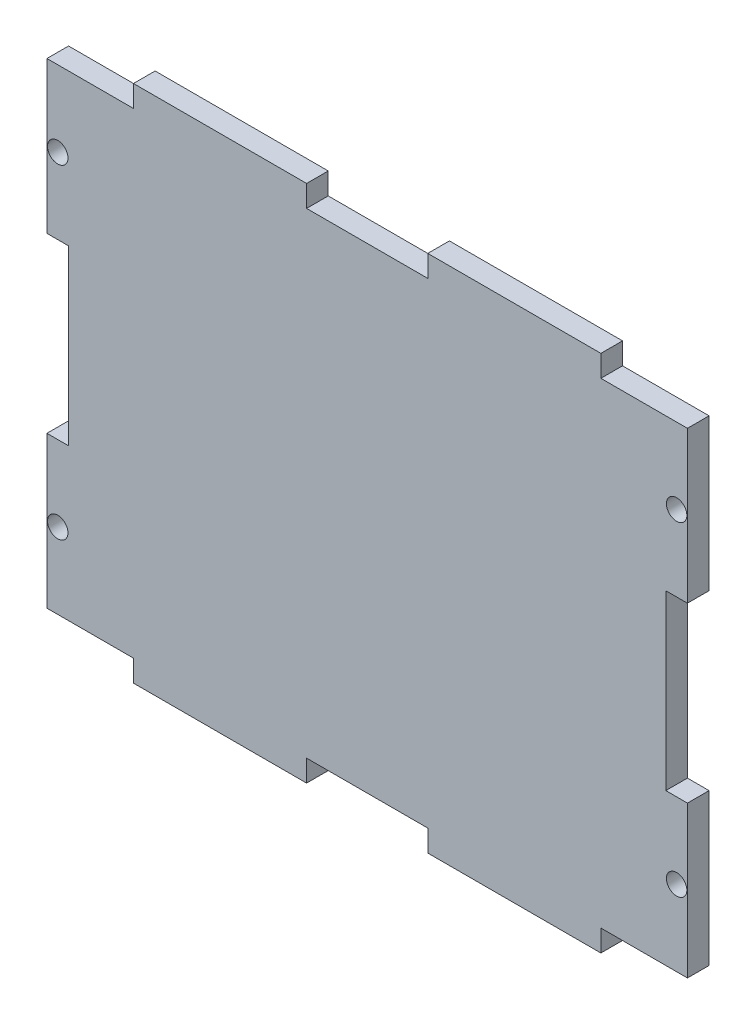
ISO-10303-21;
HEADER;
FILE_DESCRIPTION(('STEP AP214'),'2;1');
FILE_NAME('part.step','',(''),(''),'','','');
FILE_SCHEMA(('AUTOMOTIVE_DESIGN { 1 0 10303 214 1 1 1 1 }'));
ENDSEC;
DATA;
#1=APPLICATION_CONTEXT('core data for automotive mechanical design processes');
#2=APPLICATION_PROTOCOL_DEFINITION('international standard','automotive_design',2000,#1);
#3=PRODUCT_CONTEXT('',#1,'mechanical');
#4=PRODUCT('Part','Part','',(#3));
#5=PRODUCT_RELATED_PRODUCT_CATEGORY('part','',(#4));
#6=PRODUCT_DEFINITION_FORMATION('','',#4);
#7=PRODUCT_DEFINITION_CONTEXT('part definition',#1,'design');
#8=PRODUCT_DEFINITION('design','',#6,#7);
#9=PRODUCT_DEFINITION_SHAPE('','',#8);
#10=(LENGTH_UNIT() NAMED_UNIT(*) SI_UNIT(.MILLI.,.METRE.));
#11=(NAMED_UNIT(*) PLANE_ANGLE_UNIT() SI_UNIT($,.RADIAN.));
#12=(NAMED_UNIT(*) SI_UNIT($,.STERADIAN.) SOLID_ANGLE_UNIT());
#13=UNCERTAINTY_MEASURE_WITH_UNIT(LENGTH_MEASURE(1.E-05),#10,'distance_accuracy_value','');
#14=(GEOMETRIC_REPRESENTATION_CONTEXT(3) GLOBAL_UNCERTAINTY_ASSIGNED_CONTEXT((#13)) GLOBAL_UNIT_ASSIGNED_CONTEXT((#10,
#11,#12)) REPRESENTATION_CONTEXT('',''));
#15=CARTESIAN_POINT('',(0.,0.,0.));
#16=DIRECTION('',(0.,0.,1.));
#17=DIRECTION('',(1.,0.,0.));
#18=AXIS2_PLACEMENT_3D('',#15,#16,#17);
#19=CARTESIAN_POINT('',(-46.99,-38.1,3.175));
#20=DIRECTION('',(1.,0.,0.));
#21=DIRECTION('',(0.,0.,-1.));
#22=AXIS2_PLACEMENT_3D('',#19,#20,#21);
#23=PLANE('',#22);
#24=DIRECTION('',(0.,-1.,0.));
#25=VECTOR('',#24,1.);
#26=CARTESIAN_POINT('',(-46.99,-38.1,3.175));
#27=LINE('',#26,#25);
#28=CARTESIAN_POINT('',(-46.99,-12.7,3.175));
#29=VERTEX_POINT('',#28);
#30=CARTESIAN_POINT('',(-46.99,-34.925,3.175));
#31=VERTEX_POINT('',#30);
#32=EDGE_CURVE('E244',#29,#31,#27,.T.);
#33=ORIENTED_EDGE('',*,*,#32,.F.);
#34=DIRECTION('',(0.,0.,-1.));
#35=VECTOR('',#34,1.);
#36=CARTESIAN_POINT('',(-46.99,-12.7,3.175));
#37=LINE('',#36,#35);
#38=CARTESIAN_POINT('',(-46.99,-12.7,0.));
#39=VERTEX_POINT('',#38);
#40=EDGE_CURVE('E268',#29,#39,#37,.T.);
#41=ORIENTED_EDGE('',*,*,#40,.T.);
#42=DIRECTION('',(0.,-1.,0.));
#43=VECTOR('',#42,1.);
#44=CARTESIAN_POINT('',(-46.99,-38.1,0.));
#45=LINE('',#44,#43);
#46=CARTESIAN_POINT('',(-46.99,-34.925,0.));
#47=VERTEX_POINT('',#46);
#48=EDGE_CURVE('E258',#39,#47,#45,.T.);
#49=ORIENTED_EDGE('',*,*,#48,.T.);
#50=DIRECTION('',(0.,0.,1.));
#51=VECTOR('',#50,1.);
#52=CARTESIAN_POINT('',(-46.99,-34.925,0.));
#53=LINE('',#52,#51);
#54=EDGE_CURVE('E267',#47,#31,#53,.T.);
#55=ORIENTED_EDGE('',*,*,#54,.T.);
#56=EDGE_LOOP('',(#33,#41,#49,#55));
#57=FACE_BOUND('',#56,.T.);
#58=ADVANCED_FACE('F33',(#57),#23,.F.);
#59=CARTESIAN_POINT('',(46.99,-38.1,3.175));
#60=DIRECTION('',(-1.,0.,0.));
#61=DIRECTION('',(0.,0.,1.));
#62=AXIS2_PLACEMENT_3D('',#59,#60,#61);
#63=PLANE('',#62);
#64=DIRECTION('',(0.,1.,0.));
#65=VECTOR('',#64,1.);
#66=CARTESIAN_POINT('',(46.99,-38.1,0.));
#67=LINE('',#66,#65);
#68=CARTESIAN_POINT('',(46.99,-34.925,0.));
#69=VERTEX_POINT('',#68);
#70=CARTESIAN_POINT('',(46.99,-12.7,0.));
#71=VERTEX_POINT('',#70);
#72=EDGE_CURVE('E251',#69,#71,#67,.T.);
#73=ORIENTED_EDGE('',*,*,#72,.T.);
#74=DIRECTION('',(0.,0.,-1.));
#75=VECTOR('',#74,1.);
#76=CARTESIAN_POINT('',(46.99,-12.7,3.175));
#77=LINE('',#76,#75);
#78=CARTESIAN_POINT('',(46.99,-12.7,3.175));
#79=VERTEX_POINT('',#78);
#80=EDGE_CURVE('E489',#79,#71,#77,.T.);
#81=ORIENTED_EDGE('',*,*,#80,.F.);
#82=DIRECTION('',(0.,1.,0.));
#83=VECTOR('',#82,1.);
#84=CARTESIAN_POINT('',(46.99,-38.1,3.175));
#85=LINE('',#84,#83);
#86=CARTESIAN_POINT('',(46.99,-34.925,3.175));
#87=VERTEX_POINT('',#86);
#88=EDGE_CURVE('E296',#87,#79,#85,.T.);
#89=ORIENTED_EDGE('',*,*,#88,.F.);
#90=DIRECTION('',(0.,0.,1.));
#91=VECTOR('',#90,1.);
#92=CARTESIAN_POINT('',(46.99,-34.925,0.));
#93=LINE('',#92,#91);
#94=EDGE_CURVE('E335',#69,#87,#93,.T.);
#95=ORIENTED_EDGE('',*,*,#94,.F.);
#96=EDGE_LOOP('',(#73,#81,#89,#95));
#97=FACE_BOUND('',#96,.T.);
#98=ADVANCED_FACE('F363',(#97),#63,.F.);
#99=CARTESIAN_POINT('',(-46.99,38.1,3.175));
#100=DIRECTION('',(0.,-1.,0.));
#101=DIRECTION('',(0.,0.,-1.));
#102=AXIS2_PLACEMENT_3D('',#99,#100,#101);
#103=PLANE('',#102);
#104=DIRECTION('',(-1.,0.,0.));
#105=VECTOR('',#104,1.);
#106=CARTESIAN_POINT('',(-46.99,38.1,0.));
#107=LINE('',#106,#105);
#108=CARTESIAN_POINT('',(-8.88999999999997,38.1,0.));
#109=VERTEX_POINT('',#108);
#110=CARTESIAN_POINT('',(-34.29,38.1,0.));
#111=VERTEX_POINT('',#110);
#112=EDGE_CURVE('E254',#109,#111,#107,.T.);
#113=ORIENTED_EDGE('',*,*,#112,.T.);
#114=DIRECTION('',(0.,0.,1.));
#115=VECTOR('',#114,1.);
#116=CARTESIAN_POINT('',(-34.29,38.1,0.));
#117=LINE('',#116,#115);
#118=CARTESIAN_POINT('',(-34.29,38.1,3.175));
#119=VERTEX_POINT('',#118);
#120=EDGE_CURVE('E397',#111,#119,#117,.T.);
#121=ORIENTED_EDGE('',*,*,#120,.T.);
#122=DIRECTION('',(-1.,0.,0.));
#123=VECTOR('',#122,1.);
#124=CARTESIAN_POINT('',(-46.99,38.1,3.175));
#125=LINE('',#124,#123);
#126=CARTESIAN_POINT('',(-8.88999999999997,38.1,3.175));
#127=VERTEX_POINT('',#126);
#128=EDGE_CURVE('E298',#127,#119,#125,.T.);
#129=ORIENTED_EDGE('',*,*,#128,.F.);
#130=DIRECTION('',(0.,0.,1.));
#131=VECTOR('',#130,1.);
#132=CARTESIAN_POINT('',(-8.88999999999997,38.1,0.));
#133=LINE('',#132,#131);
#134=EDGE_CURVE('E398',#109,#127,#133,.T.);
#135=ORIENTED_EDGE('',*,*,#134,.F.);
#136=EDGE_LOOP('',(#113,#121,#129,#135));
#137=FACE_BOUND('',#136,.T.);
#138=ADVANCED_FACE('F369',(#137),#103,.F.);
#139=CARTESIAN_POINT('',(-46.99,-38.1,3.175));
#140=DIRECTION('',(0.,1.,0.));
#141=DIRECTION('',(0.,0.,1.));
#142=AXIS2_PLACEMENT_3D('',#139,#140,#141);
#143=PLANE('',#142);
#144=DIRECTION('',(1.,0.,0.));
#145=VECTOR('',#144,1.);
#146=CARTESIAN_POINT('',(-46.99,-38.1,0.));
#147=LINE('',#146,#145);
#148=CARTESIAN_POINT('',(8.89,-38.1,0.));
#149=VERTEX_POINT('',#148);
#150=CARTESIAN_POINT('',(34.29,-38.1,0.));
#151=VERTEX_POINT('',#150);
#152=EDGE_CURVE('E259',#149,#151,#147,.T.);
#153=ORIENTED_EDGE('',*,*,#152,.T.);
#154=DIRECTION('',(0.,0.,1.));
#155=VECTOR('',#154,1.);
#156=CARTESIAN_POINT('',(34.29,-38.1,0.));
#157=LINE('',#156,#155);
#158=CARTESIAN_POINT('',(34.29,-38.1,3.175));
#159=VERTEX_POINT('',#158);
#160=EDGE_CURVE('E474',#151,#159,#157,.T.);
#161=ORIENTED_EDGE('',*,*,#160,.T.);
#162=DIRECTION('',(1.,0.,0.));
#163=VECTOR('',#162,1.);
#164=CARTESIAN_POINT('',(-46.99,-38.1,3.175));
#165=LINE('',#164,#163);
#166=CARTESIAN_POINT('',(8.89,-38.1,3.175));
#167=VERTEX_POINT('',#166);
#168=EDGE_CURVE('E42',#167,#159,#165,.T.);
#169=ORIENTED_EDGE('',*,*,#168,.F.);
#170=DIRECTION('',(0.,0.,1.));
#171=VECTOR('',#170,1.);
#172=CARTESIAN_POINT('',(8.89,-38.1,0.));
#173=LINE('',#172,#171);
#174=EDGE_CURVE('E340',#149,#167,#173,.T.);
#175=ORIENTED_EDGE('',*,*,#174,.F.);
#176=EDGE_LOOP('',(#153,#161,#169,#175));
#177=FACE_BOUND('',#176,.T.);
#178=ADVANCED_FACE('F379',(#177),#143,.F.);
#179=CARTESIAN_POINT('',(46.99,12.7,3.175));
#180=VERTEX_POINT('',#179);
#181=CARTESIAN_POINT('',(46.99,34.925,3.175));
#182=VERTEX_POINT('',#181);
#183=EDGE_CURVE('E299',#180,#182,#85,.T.);
#184=ORIENTED_EDGE('',*,*,#183,.F.);
#185=DIRECTION('',(0.,0.,-1.));
#186=VECTOR('',#185,1.);
#187=CARTESIAN_POINT('',(46.99,12.7,3.175));
#188=LINE('',#187,#186);
#189=CARTESIAN_POINT('',(46.99,12.7,0.));
#190=VERTEX_POINT('',#189);
#191=EDGE_CURVE('E492',#180,#190,#188,.T.);
#192=ORIENTED_EDGE('',*,*,#191,.T.);
#193=CARTESIAN_POINT('',(46.99,34.925,0.));
#194=VERTEX_POINT('',#193);
#195=EDGE_CURVE('E255',#190,#194,#67,.T.);
#196=ORIENTED_EDGE('',*,*,#195,.T.);
#197=DIRECTION('',(0.,0.,1.));
#198=VECTOR('',#197,1.);
#199=CARTESIAN_POINT('',(46.99,34.925,0.));
#200=LINE('',#199,#198);
#201=EDGE_CURVE('E455',#194,#182,#200,.T.);
#202=ORIENTED_EDGE('',*,*,#201,.T.);
#203=EDGE_LOOP('',(#184,#192,#196,#202));
#204=FACE_BOUND('',#203,.T.);
#205=ADVANCED_FACE('F35',(#204),#63,.F.);
#206=CARTESIAN_POINT('',(34.29,38.1,0.));
#207=VERTEX_POINT('',#206);
#208=CARTESIAN_POINT('',(8.89000000000002,38.1,0.));
#209=VERTEX_POINT('',#208);
#210=EDGE_CURVE('E256',#207,#209,#107,.T.);
#211=ORIENTED_EDGE('',*,*,#210,.T.);
#212=DIRECTION('',(0.,0.,1.));
#213=VECTOR('',#212,1.);
#214=CARTESIAN_POINT('',(8.89000000000002,38.1,0.));
#215=LINE('',#214,#213);
#216=CARTESIAN_POINT('',(8.89000000000002,38.1,3.175));
#217=VERTEX_POINT('',#216);
#218=EDGE_CURVE('E440',#209,#217,#215,.T.);
#219=ORIENTED_EDGE('',*,*,#218,.T.);
#220=CARTESIAN_POINT('',(34.29,38.1,3.175));
#221=VERTEX_POINT('',#220);
#222=EDGE_CURVE('E247',#221,#217,#125,.T.);
#223=ORIENTED_EDGE('',*,*,#222,.F.);
#224=DIRECTION('',(0.,0.,1.));
#225=VECTOR('',#224,1.);
#226=CARTESIAN_POINT('',(34.29,38.1,0.));
#227=LINE('',#226,#225);
#228=EDGE_CURVE('E451',#207,#221,#227,.T.);
#229=ORIENTED_EDGE('',*,*,#228,.F.);
#230=EDGE_LOOP('',(#211,#219,#223,#229));
#231=FACE_BOUND('',#230,.T.);
#232=ADVANCED_FACE('F373',(#231),#103,.F.);
#233=CARTESIAN_POINT('',(-46.99,34.925,0.));
#234=VERTEX_POINT('',#233);
#235=CARTESIAN_POINT('',(-46.99,12.7,0.));
#236=VERTEX_POINT('',#235);
#237=EDGE_CURVE('E236',#234,#236,#45,.T.);
#238=ORIENTED_EDGE('',*,*,#237,.T.);
#239=DIRECTION('',(0.,0.,-1.));
#240=VECTOR('',#239,1.);
#241=CARTESIAN_POINT('',(-46.99,12.7,3.175));
#242=LINE('',#241,#240);
#243=CARTESIAN_POINT('',(-46.99,12.7,3.175));
#244=VERTEX_POINT('',#243);
#245=EDGE_CURVE('E50',#244,#236,#242,.T.);
#246=ORIENTED_EDGE('',*,*,#245,.F.);
#247=CARTESIAN_POINT('',(-46.99,34.925,3.175));
#248=VERTEX_POINT('',#247);
#249=EDGE_CURVE('E234',#248,#244,#27,.T.);
#250=ORIENTED_EDGE('',*,*,#249,.F.);
#251=DIRECTION('',(0.,0.,1.));
#252=VECTOR('',#251,1.);
#253=CARTESIAN_POINT('',(-46.99,34.925,0.));
#254=LINE('',#253,#252);
#255=EDGE_CURVE('E418',#234,#248,#254,.T.);
#256=ORIENTED_EDGE('',*,*,#255,.F.);
#257=EDGE_LOOP('',(#238,#246,#250,#256));
#258=FACE_BOUND('',#257,.T.);
#259=ADVANCED_FACE('F232',(#258),#23,.F.);
#260=CARTESIAN_POINT('',(-34.29,-38.1,0.));
#261=VERTEX_POINT('',#260);
#262=CARTESIAN_POINT('',(-8.89,-38.1,0.));
#263=VERTEX_POINT('',#262);
#264=EDGE_CURVE('E37',#261,#263,#147,.T.);
#265=ORIENTED_EDGE('',*,*,#264,.T.);
#266=DIRECTION('',(0.,0.,1.));
#267=VECTOR('',#266,1.);
#268=CARTESIAN_POINT('',(-8.89,-38.1,0.));
#269=LINE('',#268,#267);
#270=CARTESIAN_POINT('',(-8.89,-38.1,3.175));
#271=VERTEX_POINT('',#270);
#272=EDGE_CURVE('E314',#263,#271,#269,.T.);
#273=ORIENTED_EDGE('',*,*,#272,.T.);
#274=CARTESIAN_POINT('',(-34.29,-38.1,3.175));
#275=VERTEX_POINT('',#274);
#276=EDGE_CURVE('E11',#275,#271,#165,.T.);
#277=ORIENTED_EDGE('',*,*,#276,.F.);
#278=DIRECTION('',(0.,0.,1.));
#279=VECTOR('',#278,1.);
#280=CARTESIAN_POINT('',(-34.29,-38.1,0.));
#281=LINE('',#280,#279);
#282=EDGE_CURVE('E280',#261,#275,#281,.T.);
#283=ORIENTED_EDGE('',*,*,#282,.F.);
#284=EDGE_LOOP('',(#265,#273,#277,#283));
#285=FACE_BOUND('',#284,.T.);
#286=ADVANCED_FACE('F312',(#285),#143,.F.);
#287=CARTESIAN_POINT('',(0.,0.,3.175));
#288=DIRECTION('',(0.,0.,-1.));
#289=DIRECTION('',(-1.,0.,0.));
#290=AXIS2_PLACEMENT_3D('',#287,#288,#289);
#291=PLANE('',#290);
#292=CARTESIAN_POINT('',(-45.4025,23.8125,3.175));
#293=DIRECTION('',(0.,0.,-1.));
#294=DIRECTION('',(1.,0.,0.));
#295=AXIS2_PLACEMENT_3D('',#292,#293,#294);
#296=CIRCLE('',#295,1.49999999999999);
#297=CARTESIAN_POINT('',(-43.9025,23.8125,3.175));
#298=VERTEX_POINT('',#297);
#299=EDGE_CURVE('E544',#298,#298,#296,.T.);
#300=ORIENTED_EDGE('',*,*,#299,.T.);
#301=EDGE_LOOP('',(#300));
#302=FACE_BOUND('',#301,.T.);
#303=CARTESIAN_POINT('',(-45.4025,-23.8125,3.175));
#304=DIRECTION('',(0.,0.,-1.));
#305=DIRECTION('',(-1.,0.,0.));
#306=AXIS2_PLACEMENT_3D('',#303,#304,#305);
#307=CIRCLE('',#306,1.50000000000002);
#308=CARTESIAN_POINT('',(-46.9025,-23.8125,3.175));
#309=VERTEX_POINT('',#308);
#310=EDGE_CURVE('E538',#309,#309,#307,.T.);
#311=ORIENTED_EDGE('',*,*,#310,.T.);
#312=EDGE_LOOP('',(#311));
#313=FACE_BOUND('',#312,.T.);
#314=CARTESIAN_POINT('',(45.4025,-23.8125,3.175));
#315=DIRECTION('',(0.,0.,-1.));
#316=DIRECTION('',(1.,0.,0.));
#317=AXIS2_PLACEMENT_3D('',#314,#315,#316);
#318=CIRCLE('',#317,1.5);
#319=CARTESIAN_POINT('',(46.9025,-23.8125,3.175));
#320=VERTEX_POINT('',#319);
#321=EDGE_CURVE('E532',#320,#320,#318,.T.);
#322=ORIENTED_EDGE('',*,*,#321,.T.);
#323=EDGE_LOOP('',(#322));
#324=FACE_BOUND('',#323,.T.);
#325=CARTESIAN_POINT('',(45.4025,23.8125,3.175));
#326=DIRECTION('',(0.,0.,-1.));
#327=DIRECTION('',(-1.,0.,0.));
#328=AXIS2_PLACEMENT_3D('',#325,#326,#327);
#329=CIRCLE('',#328,1.5);
#330=CARTESIAN_POINT('',(43.9025,23.8125,3.175));
#331=VERTEX_POINT('',#330);
#332=EDGE_CURVE('E525',#331,#331,#329,.T.);
#333=ORIENTED_EDGE('',*,*,#332,.T.);
#334=EDGE_LOOP('',(#333));
#335=FACE_BOUND('',#334,.T.);
#336=DIRECTION('',(0.,-1.,0.));
#337=VECTOR('',#336,1.);
#338=CARTESIAN_POINT('',(-43.815,-12.7,3.175));
#339=LINE('',#338,#337);
#340=CARTESIAN_POINT('',(-43.815,12.7,3.175));
#341=VERTEX_POINT('',#340);
#342=CARTESIAN_POINT('',(-43.815,-12.7,3.175));
#343=VERTEX_POINT('',#342);
#344=EDGE_CURVE('E226',#341,#343,#339,.T.);
#345=ORIENTED_EDGE('',*,*,#344,.T.);
#346=DIRECTION('',(-1.,0.,0.));
#347=VECTOR('',#346,1.);
#348=CARTESIAN_POINT('',(-43.815,-12.7,3.175));
#349=LINE('',#348,#347);
#350=EDGE_CURVE('E237',#343,#29,#349,.T.);
#351=ORIENTED_EDGE('',*,*,#350,.T.);
#352=ORIENTED_EDGE('',*,*,#32,.T.);
#353=DIRECTION('',(-1.,0.,0.));
#354=VECTOR('',#353,1.);
#355=CARTESIAN_POINT('',(-46.99,-34.925,3.175));
#356=LINE('',#355,#354);
#357=CARTESIAN_POINT('',(-34.29,-34.925,3.175));
#358=VERTEX_POINT('',#357);
#359=EDGE_CURVE('E279',#358,#31,#356,.T.);
#360=ORIENTED_EDGE('',*,*,#359,.F.);
#361=DIRECTION('',(0.,1.,0.));
#362=VECTOR('',#361,1.);
#363=CARTESIAN_POINT('',(-34.29,-38.1,3.175));
#364=LINE('',#363,#362);
#365=EDGE_CURVE('E291',#275,#358,#364,.T.);
#366=ORIENTED_EDGE('',*,*,#365,.F.);
#367=ORIENTED_EDGE('',*,*,#276,.T.);
#368=DIRECTION('',(0.,-1.,0.));
#369=VECTOR('',#368,1.);
#370=CARTESIAN_POINT('',(-8.89,-38.1,3.175));
#371=LINE('',#370,#369);
#372=CARTESIAN_POINT('',(-8.89,-34.925,3.175));
#373=VERTEX_POINT('',#372);
#374=EDGE_CURVE('E334',#373,#271,#371,.T.);
#375=ORIENTED_EDGE('',*,*,#374,.F.);
#376=DIRECTION('',(-1.,0.,0.));
#377=VECTOR('',#376,1.);
#378=CARTESIAN_POINT('',(-8.89,-34.925,3.175));
#379=LINE('',#378,#377);
#380=CARTESIAN_POINT('',(8.89,-34.925,3.175));
#381=VERTEX_POINT('',#380);
#382=EDGE_CURVE('E331',#381,#373,#379,.T.);
#383=ORIENTED_EDGE('',*,*,#382,.F.);
#384=DIRECTION('',(0.,1.,0.));
#385=VECTOR('',#384,1.);
#386=CARTESIAN_POINT('',(8.89,-38.1,3.175));
#387=LINE('',#386,#385);
#388=EDGE_CURVE('E327',#167,#381,#387,.T.);
#389=ORIENTED_EDGE('',*,*,#388,.F.);
#390=ORIENTED_EDGE('',*,*,#168,.T.);
#391=DIRECTION('',(0.,-1.,0.));
#392=VECTOR('',#391,1.);
#393=CARTESIAN_POINT('',(34.29,-38.1,3.175));
#394=LINE('',#393,#392);
#395=CARTESIAN_POINT('',(34.29,-34.925,3.175));
#396=VERTEX_POINT('',#395);
#397=EDGE_CURVE('E466',#396,#159,#394,.T.);
#398=ORIENTED_EDGE('',*,*,#397,.F.);
#399=DIRECTION('',(-1.,0.,0.));
#400=VECTOR('',#399,1.);
#401=CARTESIAN_POINT('',(34.29,-34.925,3.175));
#402=LINE('',#401,#400);
#403=EDGE_CURVE('E458',#87,#396,#402,.T.);
#404=ORIENTED_EDGE('',*,*,#403,.F.);
#405=ORIENTED_EDGE('',*,*,#88,.T.);
#406=DIRECTION('',(-1.,0.,0.));
#407=VECTOR('',#406,1.);
#408=CARTESIAN_POINT('',(46.99,-12.7,3.175));
#409=LINE('',#408,#407);
#410=CARTESIAN_POINT('',(43.815,-12.7,3.175));
#411=VERTEX_POINT('',#410);
#412=EDGE_CURVE('E499',#79,#411,#409,.T.);
#413=ORIENTED_EDGE('',*,*,#412,.T.);
#414=DIRECTION('',(0.,1.,0.));
#415=VECTOR('',#414,1.);
#416=CARTESIAN_POINT('',(43.815,12.7,3.175));
#417=LINE('',#416,#415);
#418=CARTESIAN_POINT('',(43.815,12.7,3.175));
#419=VERTEX_POINT('',#418);
#420=EDGE_CURVE('E506',#411,#419,#417,.T.);
#421=ORIENTED_EDGE('',*,*,#420,.T.);
#422=DIRECTION('',(1.,0.,0.));
#423=VECTOR('',#422,1.);
#424=CARTESIAN_POINT('',(46.99,12.7,3.175));
#425=LINE('',#424,#423);
#426=EDGE_CURVE('E503',#419,#180,#425,.T.);
#427=ORIENTED_EDGE('',*,*,#426,.T.);
#428=ORIENTED_EDGE('',*,*,#183,.T.);
#429=DIRECTION('',(1.,0.,0.));
#430=VECTOR('',#429,1.);
#431=CARTESIAN_POINT('',(34.29,34.925,3.175));
#432=LINE('',#431,#430);
#433=CARTESIAN_POINT('',(34.29,34.925,3.175));
#434=VERTEX_POINT('',#433);
#435=EDGE_CURVE('E448',#434,#182,#432,.T.);
#436=ORIENTED_EDGE('',*,*,#435,.F.);
#437=DIRECTION('',(0.,-1.,0.));
#438=VECTOR('',#437,1.);
#439=CARTESIAN_POINT('',(34.29,38.1,3.175));
#440=LINE('',#439,#438);
#441=EDGE_CURVE('E438',#221,#434,#440,.T.);
#442=ORIENTED_EDGE('',*,*,#441,.F.);
#443=ORIENTED_EDGE('',*,*,#222,.T.);
#444=DIRECTION('',(0.,1.,0.));
#445=VECTOR('',#444,1.);
#446=CARTESIAN_POINT('',(8.89000000000002,38.1,3.175));
#447=LINE('',#446,#445);
#448=CARTESIAN_POINT('',(8.89000000000001,34.925,3.175));
#449=VERTEX_POINT('',#448);
#450=EDGE_CURVE('E432',#449,#217,#447,.T.);
#451=ORIENTED_EDGE('',*,*,#450,.F.);
#452=DIRECTION('',(1.,0.,0.));
#453=VECTOR('',#452,1.);
#454=CARTESIAN_POINT('',(-8.88999999999999,34.925,3.175));
#455=LINE('',#454,#453);
#456=CARTESIAN_POINT('',(-8.88999999999999,34.925,3.175));
#457=VERTEX_POINT('',#456);
#458=EDGE_CURVE('E420',#457,#449,#455,.T.);
#459=ORIENTED_EDGE('',*,*,#458,.F.);
#460=DIRECTION('',(0.,-1.,0.));
#461=VECTOR('',#460,1.);
#462=CARTESIAN_POINT('',(-8.88999999999997,38.1,3.175));
#463=LINE('',#462,#461);
#464=EDGE_CURVE('E425',#127,#457,#463,.T.);
#465=ORIENTED_EDGE('',*,*,#464,.F.);
#466=ORIENTED_EDGE('',*,*,#128,.T.);
#467=DIRECTION('',(0.,1.,0.));
#468=VECTOR('',#467,1.);
#469=CARTESIAN_POINT('',(-34.29,38.1,3.175));
#470=LINE('',#469,#468);
#471=CARTESIAN_POINT('',(-34.29,34.925,3.175));
#472=VERTEX_POINT('',#471);
#473=EDGE_CURVE('E411',#472,#119,#470,.T.);
#474=ORIENTED_EDGE('',*,*,#473,.F.);
#475=DIRECTION('',(1.,0.,0.));
#476=VECTOR('',#475,1.);
#477=CARTESIAN_POINT('',(-46.99,34.925,3.175));
#478=LINE('',#477,#476);
#479=EDGE_CURVE('E243',#248,#472,#478,.T.);
#480=ORIENTED_EDGE('',*,*,#479,.F.);
#481=ORIENTED_EDGE('',*,*,#249,.T.);
#482=DIRECTION('',(1.,0.,0.));
#483=VECTOR('',#482,1.);
#484=CARTESIAN_POINT('',(-43.815,12.7,3.175));
#485=LINE('',#484,#483);
#486=EDGE_CURVE('E219',#244,#341,#485,.T.);
#487=ORIENTED_EDGE('',*,*,#486,.T.);
#488=EDGE_LOOP('',(#345,#351,#352,#360,#366,#367,#375,#383,#389,#390,#398,#404,#405,#413,#421,
#427,#428,#436,#442,#443,#451,#459,#465,#466,#474,#480,#481,#487));
#489=FACE_BOUND('',#488,.T.);
#490=ADVANCED_FACE('F240',(#302,#313,#324,#335,#489),#291,.F.);
#491=CARTESIAN_POINT('',(0.,0.,0.));
#492=DIRECTION('',(0.,0.,-1.));
#493=DIRECTION('',(-1.,0.,0.));
#494=AXIS2_PLACEMENT_3D('',#491,#492,#493);
#495=PLANE('',#494);
#496=CARTESIAN_POINT('',(-45.4025,23.8125,0.));
#497=DIRECTION('',(0.,0.,-1.));
#498=DIRECTION('',(1.,0.,0.));
#499=AXIS2_PLACEMENT_3D('',#496,#497,#498);
#500=CIRCLE('',#499,1.49999999999999);
#501=CARTESIAN_POINT('',(-43.9025,23.8125,0.));
#502=VERTEX_POINT('',#501);
#503=EDGE_CURVE('E547',#502,#502,#500,.T.);
#504=ORIENTED_EDGE('',*,*,#503,.F.);
#505=EDGE_LOOP('',(#504));
#506=FACE_BOUND('',#505,.T.);
#507=CARTESIAN_POINT('',(-45.4025,-23.8125,0.));
#508=DIRECTION('',(0.,0.,-1.));
#509=DIRECTION('',(-1.,0.,0.));
#510=AXIS2_PLACEMENT_3D('',#507,#508,#509);
#511=CIRCLE('',#510,1.50000000000002);
#512=CARTESIAN_POINT('',(-46.9025,-23.8125,0.));
#513=VERTEX_POINT('',#512);
#514=EDGE_CURVE('E541',#513,#513,#511,.T.);
#515=ORIENTED_EDGE('',*,*,#514,.F.);
#516=EDGE_LOOP('',(#515));
#517=FACE_BOUND('',#516,.T.);
#518=CARTESIAN_POINT('',(45.4025,-23.8125,0.));
#519=DIRECTION('',(0.,0.,-1.));
#520=DIRECTION('',(1.,0.,0.));
#521=AXIS2_PLACEMENT_3D('',#518,#519,#520);
#522=CIRCLE('',#521,1.5);
#523=CARTESIAN_POINT('',(46.9025,-23.8125,0.));
#524=VERTEX_POINT('',#523);
#525=EDGE_CURVE('E535',#524,#524,#522,.T.);
#526=ORIENTED_EDGE('',*,*,#525,.F.);
#527=EDGE_LOOP('',(#526));
#528=FACE_BOUND('',#527,.T.);
#529=CARTESIAN_POINT('',(45.4025,23.8125,0.));
#530=DIRECTION('',(0.,0.,-1.));
#531=DIRECTION('',(-1.,0.,0.));
#532=AXIS2_PLACEMENT_3D('',#529,#530,#531);
#533=CIRCLE('',#532,1.5);
#534=CARTESIAN_POINT('',(43.9025,23.8125,0.));
#535=VERTEX_POINT('',#534);
#536=EDGE_CURVE('E529',#535,#535,#533,.T.);
#537=ORIENTED_EDGE('',*,*,#536,.F.);
#538=EDGE_LOOP('',(#537));
#539=FACE_BOUND('',#538,.T.);
#540=DIRECTION('',(-1.,0.,0.));
#541=VECTOR('',#540,1.);
#542=CARTESIAN_POINT('',(-43.815,-12.7,0.));
#543=LINE('',#542,#541);
#544=CARTESIAN_POINT('',(-43.815,-12.7,0.));
#545=VERTEX_POINT('',#544);
#546=EDGE_CURVE('E227',#545,#39,#543,.T.);
#547=ORIENTED_EDGE('',*,*,#546,.F.);
#548=DIRECTION('',(0.,-1.,0.));
#549=VECTOR('',#548,1.);
#550=CARTESIAN_POINT('',(-43.815,-12.7,0.));
#551=LINE('',#550,#549);
#552=CARTESIAN_POINT('',(-43.815,12.7,0.));
#553=VERTEX_POINT('',#552);
#554=EDGE_CURVE('E520',#553,#545,#551,.T.);
#555=ORIENTED_EDGE('',*,*,#554,.F.);
#556=DIRECTION('',(1.,0.,0.));
#557=VECTOR('',#556,1.);
#558=CARTESIAN_POINT('',(-43.815,12.7,0.));
#559=LINE('',#558,#557);
#560=EDGE_CURVE('E523',#236,#553,#559,.T.);
#561=ORIENTED_EDGE('',*,*,#560,.F.);
#562=ORIENTED_EDGE('',*,*,#237,.F.);
#563=DIRECTION('',(1.,0.,0.));
#564=VECTOR('',#563,1.);
#565=CARTESIAN_POINT('',(-46.99,34.925,0.));
#566=LINE('',#565,#564);
#567=CARTESIAN_POINT('',(-34.29,34.925,0.));
#568=VERTEX_POINT('',#567);
#569=EDGE_CURVE('E406',#234,#568,#566,.T.);
#570=ORIENTED_EDGE('',*,*,#569,.T.);
#571=DIRECTION('',(0.,1.,0.));
#572=VECTOR('',#571,1.);
#573=CARTESIAN_POINT('',(-34.29,38.1,0.));
#574=LINE('',#573,#572);
#575=EDGE_CURVE('E405',#568,#111,#574,.T.);
#576=ORIENTED_EDGE('',*,*,#575,.T.);
#577=ORIENTED_EDGE('',*,*,#112,.F.);
#578=DIRECTION('',(0.,-1.,0.));
#579=VECTOR('',#578,1.);
#580=CARTESIAN_POINT('',(-8.88999999999997,38.1,0.));
#581=LINE('',#580,#579);
#582=CARTESIAN_POINT('',(-8.88999999999999,34.925,0.));
#583=VERTEX_POINT('',#582);
#584=EDGE_CURVE('E402',#109,#583,#581,.T.);
#585=ORIENTED_EDGE('',*,*,#584,.T.);
#586=DIRECTION('',(1.,0.,0.));
#587=VECTOR('',#586,1.);
#588=CARTESIAN_POINT('',(-8.88999999999999,34.925,0.));
#589=LINE('',#588,#587);
#590=CARTESIAN_POINT('',(8.89000000000001,34.925,0.));
#591=VERTEX_POINT('',#590);
#592=EDGE_CURVE('E422',#583,#591,#589,.T.);
#593=ORIENTED_EDGE('',*,*,#592,.T.);
#594=DIRECTION('',(0.,1.,0.));
#595=VECTOR('',#594,1.);
#596=CARTESIAN_POINT('',(8.89000000000002,38.1,0.));
#597=LINE('',#596,#595);
#598=EDGE_CURVE('E424',#591,#209,#597,.T.);
#599=ORIENTED_EDGE('',*,*,#598,.T.);
#600=ORIENTED_EDGE('',*,*,#210,.F.);
#601=DIRECTION('',(0.,-1.,0.));
#602=VECTOR('',#601,1.);
#603=CARTESIAN_POINT('',(34.29,38.1,0.));
#604=LINE('',#603,#602);
#605=CARTESIAN_POINT('',(34.29,34.925,0.));
#606=VERTEX_POINT('',#605);
#607=EDGE_CURVE('E444',#207,#606,#604,.T.);
#608=ORIENTED_EDGE('',*,*,#607,.T.);
#609=DIRECTION('',(1.,0.,0.));
#610=VECTOR('',#609,1.);
#611=CARTESIAN_POINT('',(34.29,34.925,0.));
#612=LINE('',#611,#610);
#613=EDGE_CURVE('E447',#606,#194,#612,.T.);
#614=ORIENTED_EDGE('',*,*,#613,.T.);
#615=ORIENTED_EDGE('',*,*,#195,.F.);
#616=DIRECTION('',(1.,0.,0.));
#617=VECTOR('',#616,1.);
#618=CARTESIAN_POINT('',(46.99,12.7,0.));
#619=LINE('',#618,#617);
#620=CARTESIAN_POINT('',(43.815,12.7,0.));
#621=VERTEX_POINT('',#620);
#622=EDGE_CURVE('E511',#621,#190,#619,.T.);
#623=ORIENTED_EDGE('',*,*,#622,.F.);
#624=DIRECTION('',(0.,1.,0.));
#625=VECTOR('',#624,1.);
#626=CARTESIAN_POINT('',(43.815,12.7,0.));
#627=LINE('',#626,#625);
#628=CARTESIAN_POINT('',(43.815,-12.7,0.));
#629=VERTEX_POINT('',#628);
#630=EDGE_CURVE('E58',#629,#621,#627,.T.);
#631=ORIENTED_EDGE('',*,*,#630,.F.);
#632=DIRECTION('',(-1.,0.,0.));
#633=VECTOR('',#632,1.);
#634=CARTESIAN_POINT('',(46.99,-12.7,0.));
#635=LINE('',#634,#633);
#636=EDGE_CURVE('E512',#71,#629,#635,.T.);
#637=ORIENTED_EDGE('',*,*,#636,.F.);
#638=ORIENTED_EDGE('',*,*,#72,.F.);
#639=DIRECTION('',(-1.,0.,0.));
#640=VECTOR('',#639,1.);
#641=CARTESIAN_POINT('',(34.29,-34.925,0.));
#642=LINE('',#641,#640);
#643=CARTESIAN_POINT('',(34.29,-34.925,0.));
#644=VERTEX_POINT('',#643);
#645=EDGE_CURVE('E462',#69,#644,#642,.T.);
#646=ORIENTED_EDGE('',*,*,#645,.T.);
#647=DIRECTION('',(0.,-1.,0.));
#648=VECTOR('',#647,1.);
#649=CARTESIAN_POINT('',(34.29,-38.1,0.));
#650=LINE('',#649,#648);
#651=EDGE_CURVE('E465',#644,#151,#650,.T.);
#652=ORIENTED_EDGE('',*,*,#651,.T.);
#653=ORIENTED_EDGE('',*,*,#152,.F.);
#654=DIRECTION('',(0.,1.,0.));
#655=VECTOR('',#654,1.);
#656=CARTESIAN_POINT('',(8.89,-38.1,0.));
#657=LINE('',#656,#655);
#658=CARTESIAN_POINT('',(8.89,-34.925,0.));
#659=VERTEX_POINT('',#658);
#660=EDGE_CURVE('E323',#149,#659,#657,.T.);
#661=ORIENTED_EDGE('',*,*,#660,.T.);
#662=DIRECTION('',(-1.,0.,0.));
#663=VECTOR('',#662,1.);
#664=CARTESIAN_POINT('',(-8.89,-34.925,0.));
#665=LINE('',#664,#663);
#666=CARTESIAN_POINT('',(-8.89,-34.925,0.));
#667=VERTEX_POINT('',#666);
#668=EDGE_CURVE('E321',#659,#667,#665,.T.);
#669=ORIENTED_EDGE('',*,*,#668,.T.);
#670=DIRECTION('',(0.,-1.,0.));
#671=VECTOR('',#670,1.);
#672=CARTESIAN_POINT('',(-8.89,-38.1,0.));
#673=LINE('',#672,#671);
#674=EDGE_CURVE('E318',#667,#263,#673,.T.);
#675=ORIENTED_EDGE('',*,*,#674,.T.);
#676=ORIENTED_EDGE('',*,*,#264,.F.);
#677=DIRECTION('',(0.,1.,0.));
#678=VECTOR('',#677,1.);
#679=CARTESIAN_POINT('',(-34.29,-38.1,0.));
#680=LINE('',#679,#678);
#681=CARTESIAN_POINT('',(-34.29,-34.925,0.));
#682=VERTEX_POINT('',#681);
#683=EDGE_CURVE('E285',#261,#682,#680,.T.);
#684=ORIENTED_EDGE('',*,*,#683,.T.);
#685=DIRECTION('',(-1.,0.,0.));
#686=VECTOR('',#685,1.);
#687=CARTESIAN_POINT('',(-46.99,-34.925,0.));
#688=LINE('',#687,#686);
#689=EDGE_CURVE('E276',#682,#47,#688,.T.);
#690=ORIENTED_EDGE('',*,*,#689,.T.);
#691=ORIENTED_EDGE('',*,*,#48,.F.);
#692=EDGE_LOOP('',(#547,#555,#561,#562,#570,#576,#577,#585,#593,#599,#600,#608,#614,#615,#623,
#631,#637,#638,#646,#652,#653,#661,#669,#675,#676,#684,#690,#691));
#693=FACE_BOUND('',#692,.T.);
#694=ADVANCED_FACE('F283',(#506,#517,#528,#539,#693),#495,.T.);
#695=CARTESIAN_POINT('',(-34.29,-38.1,0.));
#696=DIRECTION('',(1.,0.,0.));
#697=DIRECTION('',(0.,0.,-1.));
#698=AXIS2_PLACEMENT_3D('',#695,#696,#697);
#699=PLANE('',#698);
#700=ORIENTED_EDGE('',*,*,#365,.T.);
#701=DIRECTION('',(0.,0.,1.));
#702=VECTOR('',#701,1.);
#703=CARTESIAN_POINT('',(-34.29,-34.925,0.));
#704=LINE('',#703,#702);
#705=EDGE_CURVE('E281',#682,#358,#704,.T.);
#706=ORIENTED_EDGE('',*,*,#705,.F.);
#707=ORIENTED_EDGE('',*,*,#683,.F.);
#708=ORIENTED_EDGE('',*,*,#282,.T.);
#709=EDGE_LOOP('',(#700,#706,#707,#708));
#710=FACE_BOUND('',#709,.T.);
#711=ADVANCED_FACE('F350',(#710),#699,.F.);
#712=CARTESIAN_POINT('',(-46.99,-34.925,0.));
#713=DIRECTION('',(0.,1.,0.));
#714=DIRECTION('',(0.,0.,1.));
#715=AXIS2_PLACEMENT_3D('',#712,#713,#714);
#716=PLANE('',#715);
#717=ORIENTED_EDGE('',*,*,#359,.T.);
#718=ORIENTED_EDGE('',*,*,#54,.F.);
#719=ORIENTED_EDGE('',*,*,#689,.F.);
#720=ORIENTED_EDGE('',*,*,#705,.T.);
#721=EDGE_LOOP('',(#717,#718,#719,#720));
#722=FACE_BOUND('',#721,.T.);
#723=ADVANCED_FACE('F275',(#722),#716,.F.);
#724=CARTESIAN_POINT('',(-8.89,-34.925,0.));
#725=DIRECTION('',(0.,1.,0.));
#726=DIRECTION('',(0.,0.,1.));
#727=AXIS2_PLACEMENT_3D('',#724,#725,#726);
#728=PLANE('',#727);
#729=ORIENTED_EDGE('',*,*,#382,.T.);
#730=DIRECTION('',(0.,0.,1.));
#731=VECTOR('',#730,1.);
#732=CARTESIAN_POINT('',(-8.89,-34.925,0.));
#733=LINE('',#732,#731);
#734=EDGE_CURVE('E325',#667,#373,#733,.T.);
#735=ORIENTED_EDGE('',*,*,#734,.F.);
#736=ORIENTED_EDGE('',*,*,#668,.F.);
#737=DIRECTION('',(0.,0.,1.));
#738=VECTOR('',#737,1.);
#739=CARTESIAN_POINT('',(8.89,-34.925,0.));
#740=LINE('',#739,#738);
#741=EDGE_CURVE('E294',#659,#381,#740,.T.);
#742=ORIENTED_EDGE('',*,*,#741,.T.);
#743=EDGE_LOOP('',(#729,#735,#736,#742));
#744=FACE_BOUND('',#743,.T.);
#745=ADVANCED_FACE('F346',(#744),#728,.F.);
#746=CARTESIAN_POINT('',(8.89,-38.1,0.));
#747=DIRECTION('',(1.,0.,0.));
#748=DIRECTION('',(0.,0.,-1.));
#749=AXIS2_PLACEMENT_3D('',#746,#747,#748);
#750=PLANE('',#749);
#751=ORIENTED_EDGE('',*,*,#388,.T.);
#752=ORIENTED_EDGE('',*,*,#741,.F.);
#753=ORIENTED_EDGE('',*,*,#660,.F.);
#754=ORIENTED_EDGE('',*,*,#174,.T.);
#755=EDGE_LOOP('',(#751,#752,#753,#754));
#756=FACE_BOUND('',#755,.T.);
#757=ADVANCED_FACE('F631',(#756),#750,.F.);
#758=CARTESIAN_POINT('',(-8.89,-38.1,0.));
#759=DIRECTION('',(-1.,0.,0.));
#760=DIRECTION('',(0.,0.,1.));
#761=AXIS2_PLACEMENT_3D('',#758,#759,#760);
#762=PLANE('',#761);
#763=ORIENTED_EDGE('',*,*,#374,.T.);
#764=ORIENTED_EDGE('',*,*,#272,.F.);
#765=ORIENTED_EDGE('',*,*,#674,.F.);
#766=ORIENTED_EDGE('',*,*,#734,.T.);
#767=EDGE_LOOP('',(#763,#764,#765,#766));
#768=FACE_BOUND('',#767,.T.);
#769=ADVANCED_FACE('F342',(#768),#762,.F.);
#770=CARTESIAN_POINT('',(34.29,-34.925,0.));
#771=DIRECTION('',(0.,1.,0.));
#772=DIRECTION('',(0.,0.,1.));
#773=AXIS2_PLACEMENT_3D('',#770,#771,#772);
#774=PLANE('',#773);
#775=ORIENTED_EDGE('',*,*,#403,.T.);
#776=DIRECTION('',(0.,0.,1.));
#777=VECTOR('',#776,1.);
#778=CARTESIAN_POINT('',(34.29,-34.925,0.));
#779=LINE('',#778,#777);
#780=EDGE_CURVE('E469',#644,#396,#779,.T.);
#781=ORIENTED_EDGE('',*,*,#780,.F.);
#782=ORIENTED_EDGE('',*,*,#645,.F.);
#783=ORIENTED_EDGE('',*,*,#94,.T.);
#784=EDGE_LOOP('',(#775,#781,#782,#783));
#785=FACE_BOUND('',#784,.T.);
#786=ADVANCED_FACE('F481',(#785),#774,.F.);
#787=CARTESIAN_POINT('',(34.29,-38.1,0.));
#788=DIRECTION('',(-1.,0.,0.));
#789=DIRECTION('',(0.,0.,1.));
#790=AXIS2_PLACEMENT_3D('',#787,#788,#789);
#791=PLANE('',#790);
#792=ORIENTED_EDGE('',*,*,#397,.T.);
#793=ORIENTED_EDGE('',*,*,#160,.F.);
#794=ORIENTED_EDGE('',*,*,#651,.F.);
#795=ORIENTED_EDGE('',*,*,#780,.T.);
#796=EDGE_LOOP('',(#792,#793,#794,#795));
#797=FACE_BOUND('',#796,.T.);
#798=ADVANCED_FACE('F478',(#797),#791,.F.);
#799=CARTESIAN_POINT('',(34.29,34.925,0.));
#800=DIRECTION('',(0.,-1.,0.));
#801=DIRECTION('',(1.,0.,0.));
#802=AXIS2_PLACEMENT_3D('',#799,#800,#801);
#803=PLANE('',#802);
#804=ORIENTED_EDGE('',*,*,#435,.T.);
#805=ORIENTED_EDGE('',*,*,#201,.F.);
#806=ORIENTED_EDGE('',*,*,#613,.F.);
#807=DIRECTION('',(0.,0.,1.));
#808=VECTOR('',#807,1.);
#809=CARTESIAN_POINT('',(34.29,34.925,0.));
#810=LINE('',#809,#808);
#811=EDGE_CURVE('E459',#606,#434,#810,.T.);
#812=ORIENTED_EDGE('',*,*,#811,.T.);
#813=EDGE_LOOP('',(#804,#805,#806,#812));
#814=FACE_BOUND('',#813,.T.);
#815=ADVANCED_FACE('F620',(#814),#803,.F.);
#816=CARTESIAN_POINT('',(34.29,38.1,0.));
#817=DIRECTION('',(-1.,0.,0.));
#818=DIRECTION('',(0.,0.,1.));
#819=AXIS2_PLACEMENT_3D('',#816,#817,#818);
#820=PLANE('',#819);
#821=ORIENTED_EDGE('',*,*,#441,.T.);
#822=ORIENTED_EDGE('',*,*,#811,.F.);
#823=ORIENTED_EDGE('',*,*,#607,.F.);
#824=ORIENTED_EDGE('',*,*,#228,.T.);
#825=EDGE_LOOP('',(#821,#822,#823,#824));
#826=FACE_BOUND('',#825,.T.);
#827=ADVANCED_FACE('F618',(#826),#820,.F.);
#828=CARTESIAN_POINT('',(-8.88999999999999,34.925,0.));
#829=DIRECTION('',(0.,-1.,0.));
#830=DIRECTION('',(0.,0.,-1.));
#831=AXIS2_PLACEMENT_3D('',#828,#829,#830);
#832=PLANE('',#831);
#833=ORIENTED_EDGE('',*,*,#458,.T.);
#834=DIRECTION('',(0.,0.,1.));
#835=VECTOR('',#834,1.);
#836=CARTESIAN_POINT('',(8.89000000000001,34.925,0.));
#837=LINE('',#836,#835);
#838=EDGE_CURVE('E429',#591,#449,#837,.T.);
#839=ORIENTED_EDGE('',*,*,#838,.F.);
#840=ORIENTED_EDGE('',*,*,#592,.F.);
#841=DIRECTION('',(0.,0.,1.));
#842=VECTOR('',#841,1.);
#843=CARTESIAN_POINT('',(-8.88999999999999,34.925,0.));
#844=LINE('',#843,#842);
#845=EDGE_CURVE('E436',#583,#457,#844,.T.);
#846=ORIENTED_EDGE('',*,*,#845,.T.);
#847=EDGE_LOOP('',(#833,#839,#840,#846));
#848=FACE_BOUND('',#847,.T.);
#849=ADVANCED_FACE('F611',(#848),#832,.F.);
#850=CARTESIAN_POINT('',(-8.88999999999997,38.1,0.));
#851=DIRECTION('',(-1.,0.,0.));
#852=DIRECTION('',(0.,-1.,0.));
#853=AXIS2_PLACEMENT_3D('',#850,#851,#852);
#854=PLANE('',#853);
#855=ORIENTED_EDGE('',*,*,#464,.T.);
#856=ORIENTED_EDGE('',*,*,#845,.F.);
#857=ORIENTED_EDGE('',*,*,#584,.F.);
#858=ORIENTED_EDGE('',*,*,#134,.T.);
#859=EDGE_LOOP('',(#855,#856,#857,#858));
#860=FACE_BOUND('',#859,.T.);
#861=ADVANCED_FACE('F608',(#860),#854,.F.);
#862=CARTESIAN_POINT('',(8.89000000000002,38.1,0.));
#863=DIRECTION('',(1.,0.,0.));
#864=DIRECTION('',(0.,1.,0.));
#865=AXIS2_PLACEMENT_3D('',#862,#863,#864);
#866=PLANE('',#865);
#867=ORIENTED_EDGE('',*,*,#450,.T.);
#868=ORIENTED_EDGE('',*,*,#218,.F.);
#869=ORIENTED_EDGE('',*,*,#598,.F.);
#870=ORIENTED_EDGE('',*,*,#838,.T.);
#871=EDGE_LOOP('',(#867,#868,#869,#870));
#872=FACE_BOUND('',#871,.T.);
#873=ADVANCED_FACE('F606',(#872),#866,.F.);
#874=CARTESIAN_POINT('',(-46.99,34.925,0.));
#875=DIRECTION('',(0.,-1.,0.));
#876=DIRECTION('',(1.,0.,0.));
#877=AXIS2_PLACEMENT_3D('',#874,#875,#876);
#878=PLANE('',#877);
#879=ORIENTED_EDGE('',*,*,#479,.T.);
#880=DIRECTION('',(0.,0.,1.));
#881=VECTOR('',#880,1.);
#882=CARTESIAN_POINT('',(-34.29,34.925,0.));
#883=LINE('',#882,#881);
#884=EDGE_CURVE('E408',#568,#472,#883,.T.);
#885=ORIENTED_EDGE('',*,*,#884,.F.);
#886=ORIENTED_EDGE('',*,*,#569,.F.);
#887=ORIENTED_EDGE('',*,*,#255,.T.);
#888=EDGE_LOOP('',(#879,#885,#886,#887));
#889=FACE_BOUND('',#888,.T.);
#890=ADVANCED_FACE('F603',(#889),#878,.F.);
#891=CARTESIAN_POINT('',(-34.29,38.1,0.));
#892=DIRECTION('',(1.,0.,0.));
#893=DIRECTION('',(0.,0.,-1.));
#894=AXIS2_PLACEMENT_3D('',#891,#892,#893);
#895=PLANE('',#894);
#896=ORIENTED_EDGE('',*,*,#473,.T.);
#897=ORIENTED_EDGE('',*,*,#120,.F.);
#898=ORIENTED_EDGE('',*,*,#575,.F.);
#899=ORIENTED_EDGE('',*,*,#884,.T.);
#900=EDGE_LOOP('',(#896,#897,#898,#899));
#901=FACE_BOUND('',#900,.T.);
#902=ADVANCED_FACE('F600',(#901),#895,.F.);
#903=CARTESIAN_POINT('',(43.815,12.7,3.175));
#904=DIRECTION('',(-1.,0.,0.));
#905=DIRECTION('',(0.,0.,1.));
#906=AXIS2_PLACEMENT_3D('',#903,#904,#905);
#907=PLANE('',#906);
#908=ORIENTED_EDGE('',*,*,#630,.T.);
#909=DIRECTION('',(0.,0.,-1.));
#910=VECTOR('',#909,1.);
#911=CARTESIAN_POINT('',(43.815,12.7,3.175));
#912=LINE('',#911,#910);
#913=EDGE_CURVE('E496',#419,#621,#912,.T.);
#914=ORIENTED_EDGE('',*,*,#913,.F.);
#915=ORIENTED_EDGE('',*,*,#420,.F.);
#916=DIRECTION('',(0.,0.,-1.));
#917=VECTOR('',#916,1.);
#918=CARTESIAN_POINT('',(43.815,-12.7,3.175));
#919=LINE('',#918,#917);
#920=EDGE_CURVE('E416',#411,#629,#919,.T.);
#921=ORIENTED_EDGE('',*,*,#920,.T.);
#922=EDGE_LOOP('',(#908,#914,#915,#921));
#923=FACE_BOUND('',#922,.T.);
#924=ADVANCED_FACE('F595',(#923),#907,.F.);
#925=CARTESIAN_POINT('',(46.99,-12.7,3.175));
#926=DIRECTION('',(0.,-1.,0.));
#927=DIRECTION('',(0.,0.,-1.));
#928=AXIS2_PLACEMENT_3D('',#925,#926,#927);
#929=PLANE('',#928);
#930=ORIENTED_EDGE('',*,*,#636,.T.);
#931=ORIENTED_EDGE('',*,*,#920,.F.);
#932=ORIENTED_EDGE('',*,*,#412,.F.);
#933=ORIENTED_EDGE('',*,*,#80,.T.);
#934=EDGE_LOOP('',(#930,#931,#932,#933));
#935=FACE_BOUND('',#934,.T.);
#936=ADVANCED_FACE('F592',(#935),#929,.F.);
#937=CARTESIAN_POINT('',(46.99,12.7,3.175));
#938=DIRECTION('',(0.,1.,0.));
#939=DIRECTION('',(0.,0.,1.));
#940=AXIS2_PLACEMENT_3D('',#937,#938,#939);
#941=PLANE('',#940);
#942=ORIENTED_EDGE('',*,*,#622,.T.);
#943=ORIENTED_EDGE('',*,*,#191,.F.);
#944=ORIENTED_EDGE('',*,*,#426,.F.);
#945=ORIENTED_EDGE('',*,*,#913,.T.);
#946=EDGE_LOOP('',(#942,#943,#944,#945));
#947=FACE_BOUND('',#946,.T.);
#948=ADVANCED_FACE('F587',(#947),#941,.F.);
#949=CARTESIAN_POINT('',(-43.815,-12.7,3.175));
#950=DIRECTION('',(0.,-1.,0.));
#951=DIRECTION('',(0.,0.,-1.));
#952=AXIS2_PLACEMENT_3D('',#949,#950,#951);
#953=PLANE('',#952);
#954=ORIENTED_EDGE('',*,*,#546,.T.);
#955=ORIENTED_EDGE('',*,*,#40,.F.);
#956=ORIENTED_EDGE('',*,*,#350,.F.);
#957=DIRECTION('',(0.,0.,-1.));
#958=VECTOR('',#957,1.);
#959=CARTESIAN_POINT('',(-43.815,-12.7,3.175));
#960=LINE('',#959,#958);
#961=EDGE_CURVE('E516',#343,#545,#960,.T.);
#962=ORIENTED_EDGE('',*,*,#961,.T.);
#963=EDGE_LOOP('',(#954,#955,#956,#962));
#964=FACE_BOUND('',#963,.T.);
#965=ADVANCED_FACE('F584',(#964),#953,.F.);
#966=CARTESIAN_POINT('',(-43.815,-12.7,3.175));
#967=DIRECTION('',(1.,0.,0.));
#968=DIRECTION('',(0.,0.,-1.));
#969=AXIS2_PLACEMENT_3D('',#966,#967,#968);
#970=PLANE('',#969);
#971=ORIENTED_EDGE('',*,*,#554,.T.);
#972=ORIENTED_EDGE('',*,*,#961,.F.);
#973=ORIENTED_EDGE('',*,*,#344,.F.);
#974=DIRECTION('',(0.,0.,-1.));
#975=VECTOR('',#974,1.);
#976=CARTESIAN_POINT('',(-43.815,12.7,3.175));
#977=LINE('',#976,#975);
#978=EDGE_CURVE('E221',#341,#553,#977,.T.);
#979=ORIENTED_EDGE('',*,*,#978,.T.);
#980=EDGE_LOOP('',(#971,#972,#973,#979));
#981=FACE_BOUND('',#980,.T.);
#982=ADVANCED_FACE('F579',(#981),#970,.F.);
#983=CARTESIAN_POINT('',(-43.815,12.7,3.175));
#984=DIRECTION('',(0.,1.,0.));
#985=DIRECTION('',(0.,0.,1.));
#986=AXIS2_PLACEMENT_3D('',#983,#984,#985);
#987=PLANE('',#986);
#988=ORIENTED_EDGE('',*,*,#560,.T.);
#989=ORIENTED_EDGE('',*,*,#978,.F.);
#990=ORIENTED_EDGE('',*,*,#486,.F.);
#991=ORIENTED_EDGE('',*,*,#245,.T.);
#992=EDGE_LOOP('',(#988,#989,#990,#991));
#993=FACE_BOUND('',#992,.T.);
#994=ADVANCED_FACE('F220',(#993),#987,.F.);
#995=CARTESIAN_POINT('',(45.4025,23.8125,3.175));
#996=DIRECTION('',(0.,0.,-1.));
#997=DIRECTION('',(-1.,0.,0.));
#998=AXIS2_PLACEMENT_3D('',#995,#996,#997);
#999=CYLINDRICAL_SURFACE('',#998,1.5);
#1000=ORIENTED_EDGE('',*,*,#332,.F.);
#1001=EDGE_LOOP('',(#1000));
#1002=FACE_BOUND('',#1001,.T.);
#1003=ORIENTED_EDGE('',*,*,#536,.T.);
#1004=EDGE_LOOP('',(#1003));
#1005=FACE_BOUND('',#1004,.T.);
#1006=ADVANCED_FACE('F568',(#1002,#1005),#999,.F.);
#1007=CARTESIAN_POINT('',(45.4025,-23.8125,3.175));
#1008=DIRECTION('',(0.,0.,-1.));
#1009=DIRECTION('',(-1.,0.,0.));
#1010=AXIS2_PLACEMENT_3D('',#1007,#1008,#1009);
#1011=CYLINDRICAL_SURFACE('',#1010,1.5);
#1012=ORIENTED_EDGE('',*,*,#321,.F.);
#1013=EDGE_LOOP('',(#1012));
#1014=FACE_BOUND('',#1013,.T.);
#1015=ORIENTED_EDGE('',*,*,#525,.T.);
#1016=EDGE_LOOP('',(#1015));
#1017=FACE_BOUND('',#1016,.T.);
#1018=ADVANCED_FACE('F570',(#1014,#1017),#1011,.F.);
#1019=CARTESIAN_POINT('',(-45.4025,-23.8125,3.175));
#1020=DIRECTION('',(0.,0.,-1.));
#1021=DIRECTION('',(-1.,0.,0.));
#1022=AXIS2_PLACEMENT_3D('',#1019,#1020,#1021);
#1023=CYLINDRICAL_SURFACE('',#1022,1.50000000000002);
#1024=ORIENTED_EDGE('',*,*,#310,.F.);
#1025=EDGE_LOOP('',(#1024));
#1026=FACE_BOUND('',#1025,.T.);
#1027=ORIENTED_EDGE('',*,*,#514,.T.);
#1028=EDGE_LOOP('',(#1027));
#1029=FACE_BOUND('',#1028,.T.);
#1030=ADVANCED_FACE('F558',(#1026,#1029),#1023,.F.);
#1031=CARTESIAN_POINT('',(-45.4025,23.8125,3.175));
#1032=DIRECTION('',(0.,0.,-1.));
#1033=DIRECTION('',(-1.,0.,0.));
#1034=AXIS2_PLACEMENT_3D('',#1031,#1032,#1033);
#1035=CYLINDRICAL_SURFACE('',#1034,1.49999999999999);
#1036=ORIENTED_EDGE('',*,*,#299,.F.);
#1037=EDGE_LOOP('',(#1036));
#1038=FACE_BOUND('',#1037,.T.);
#1039=ORIENTED_EDGE('',*,*,#503,.T.);
#1040=EDGE_LOOP('',(#1039));
#1041=FACE_BOUND('',#1040,.T.);
#1042=ADVANCED_FACE('F555',(#1038,#1041),#1035,.F.);
#1043=CLOSED_SHELL('',(#58,#98,#138,#178,#205,#232,#259,#286,#490,#694,#711,#723,#745,#757,#769,
#786,#798,#815,#827,#849,#861,#873,#890,#902,#924,#936,#948,#965,#982,#994,#1006,#1018,#1030,#1042));
#1044=MANIFOLD_SOLID_BREP('B2',#1043);
#1045=ADVANCED_BREP_SHAPE_REPRESENTATION('',(#18,#1044),#14);
#1046=SHAPE_DEFINITION_REPRESENTATION(#9,#1045);
ENDSEC;
END-ISO-10303-21;
